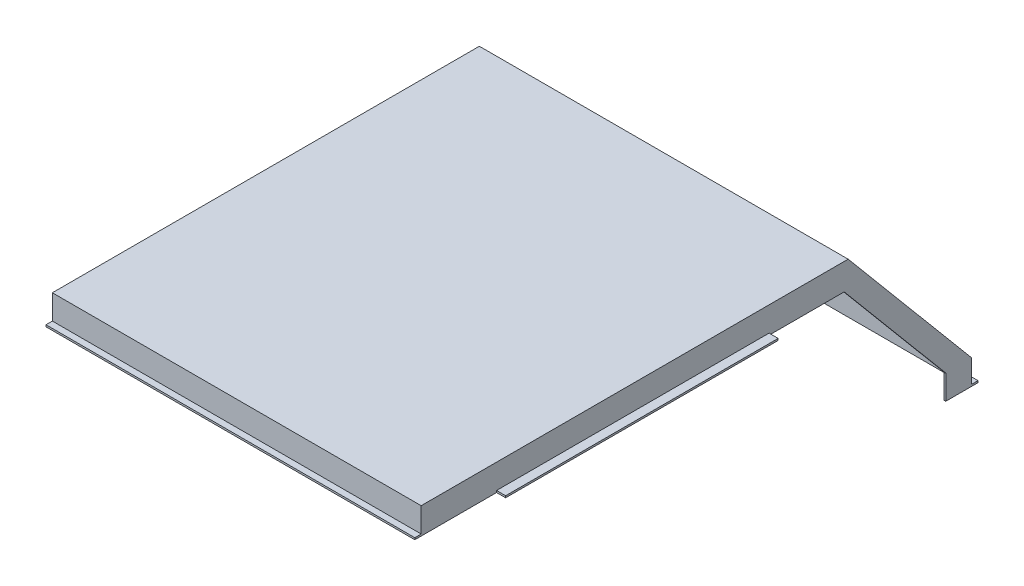
ISO-10303-21;
HEADER;
FILE_DESCRIPTION(('STEP AP214'),'2;1');
FILE_NAME('part.step','',(''),(''),'','','');
FILE_SCHEMA(('AUTOMOTIVE_DESIGN { 1 0 10303 214 1 1 1 1 }'));
ENDSEC;
DATA;
#1=APPLICATION_CONTEXT('core data for automotive mechanical design processes');
#2=APPLICATION_PROTOCOL_DEFINITION('international standard','automotive_design',2000,#1);
#3=PRODUCT_CONTEXT('',#1,'mechanical');
#4=PRODUCT('Part','Part','',(#3));
#5=PRODUCT_RELATED_PRODUCT_CATEGORY('part','',(#4));
#6=PRODUCT_DEFINITION_FORMATION('','',#4);
#7=PRODUCT_DEFINITION_CONTEXT('part definition',#1,'design');
#8=PRODUCT_DEFINITION('design','',#6,#7);
#9=PRODUCT_DEFINITION_SHAPE('','',#8);
#10=(LENGTH_UNIT() NAMED_UNIT(*) SI_UNIT(.MILLI.,.METRE.));
#11=(NAMED_UNIT(*) PLANE_ANGLE_UNIT() SI_UNIT($,.RADIAN.));
#12=(NAMED_UNIT(*) SI_UNIT($,.STERADIAN.) SOLID_ANGLE_UNIT());
#13=UNCERTAINTY_MEASURE_WITH_UNIT(LENGTH_MEASURE(1.E-05),#10,'distance_accuracy_value','');
#14=(GEOMETRIC_REPRESENTATION_CONTEXT(3) GLOBAL_UNCERTAINTY_ASSIGNED_CONTEXT((#13)) GLOBAL_UNIT_ASSIGNED_CONTEXT((#10,
#11,#12)) REPRESENTATION_CONTEXT('',''));
#15=CARTESIAN_POINT('',(0.,0.,0.));
#16=DIRECTION('',(0.,0.,1.));
#17=DIRECTION('',(1.,0.,0.));
#18=AXIS2_PLACEMENT_3D('',#15,#16,#17);
#19=CARTESIAN_POINT('',(203.,0.,-552.461255642924));
#20=DIRECTION('',(0.,0.,-1.));
#21=DIRECTION('',(-1.,0.,0.));
#22=AXIS2_PLACEMENT_3D('',#19,#20,#21);
#23=PLANE('',#22);
#24=DIRECTION('',(0.,1.,0.));
#25=VECTOR('',#24,1.);
#26=CARTESIAN_POINT('',(-151.,-185.74060970458,-552.461255642924));
#27=LINE('',#26,#25);
#28=CARTESIAN_POINT('',(-151.,-185.74060970458,-552.461255642924));
#29=VERTEX_POINT('',#28);
#30=CARTESIAN_POINT('',(-151.,-159.24060970458,-552.461255642924));
#31=VERTEX_POINT('',#30);
#32=EDGE_CURVE('E272',#29,#31,#27,.T.);
#33=ORIENTED_EDGE('',*,*,#32,.F.);
#34=DIRECTION('',(-1.,0.,0.));
#35=VECTOR('',#34,1.);
#36=CARTESIAN_POINT('',(203.,-185.74060970458,-552.461255642924));
#37=LINE('',#36,#35);
#38=CARTESIAN_POINT('',(201.,-185.74060970458,-552.461255642924));
#39=VERTEX_POINT('',#38);
#40=EDGE_CURVE('E500',#39,#29,#37,.T.);
#41=ORIENTED_EDGE('',*,*,#40,.F.);
#42=DIRECTION('',(0.,-1.,0.));
#43=VECTOR('',#42,1.);
#44=CARTESIAN_POINT('',(201.,-185.74060970458,-552.461255642924));
#45=LINE('',#44,#43);
#46=CARTESIAN_POINT('',(201.,-159.24060970458,-552.461255642924));
#47=VERTEX_POINT('',#46);
#48=EDGE_CURVE('E415',#47,#39,#45,.T.);
#49=ORIENTED_EDGE('',*,*,#48,.F.);
#50=DIRECTION('',(-1.,0.,0.));
#51=VECTOR('',#50,1.);
#52=CARTESIAN_POINT('',(203.,-159.24060970458,-552.461255642924));
#53=LINE('',#52,#51);
#54=EDGE_CURVE('E502',#47,#31,#53,.T.);
#55=ORIENTED_EDGE('',*,*,#54,.T.);
#56=EDGE_LOOP('',(#33,#41,#49,#55));
#57=FACE_BOUND('',#56,.T.);
#58=ADVANCED_FACE('F36',(#57),#23,.F.);
#59=CARTESIAN_POINT('',(203.,206.239679888601,-245.786879442717));
#60=DIRECTION('',(0.,0.642787609686544,-0.766044443118974));
#61=DIRECTION('',(0.,0.766044443118974,0.642787609686544));
#62=AXIS2_PLACEMENT_3D('',#59,#60,#61);
#63=PLANE('',#62);
#64=DIRECTION('',(0.,0.766044443118973,0.642787609686545));
#65=VECTOR('',#64,1.);
#66=CARTESIAN_POINT('',(-151.,-159.24060970458,-552.461255642924));
#67=LINE('',#66,#65);
#68=CARTESIAN_POINT('',(-151.,-76.669276521937,-483.175680423551));
#69=VERTEX_POINT('',#68);
#70=EDGE_CURVE('E286',#31,#69,#67,.T.);
#71=ORIENTED_EDGE('',*,*,#70,.F.);
#72=ORIENTED_EDGE('',*,*,#54,.F.);
#73=DIRECTION('',(0.,-0.766044443118974,-0.642787609686545));
#74=VECTOR('',#73,1.);
#75=CARTESIAN_POINT('',(201.,-159.24060970458,-552.461255642924));
#76=LINE('',#75,#74);
#77=CARTESIAN_POINT('',(201.,1.50000000000006,-417.583869324598));
#78=VERTEX_POINT('',#77);
#79=EDGE_CURVE('E437',#78,#47,#76,.T.);
#80=ORIENTED_EDGE('',*,*,#79,.F.);
#81=DIRECTION('',(-1.,0.,0.));
#82=VECTOR('',#81,1.);
#83=CARTESIAN_POINT('',(203.,1.5,-417.583869324598));
#84=LINE('',#83,#82);
#85=CARTESIAN_POINT('',(-201.,1.5,-417.583869324598));
#86=VERTEX_POINT('',#85);
#87=EDGE_CURVE('E505',#78,#86,#84,.T.);
#88=ORIENTED_EDGE('',*,*,#87,.T.);
#89=DIRECTION('',(0.,-0.766044443118974,-0.642787609686545));
#90=VECTOR('',#89,1.);
#91=CARTESIAN_POINT('',(-201.,-159.24060970458,-552.461255642924));
#92=LINE('',#91,#90);
#93=CARTESIAN_POINT('',(-201.,-76.669276521937,-483.175680423551));
#94=VERTEX_POINT('',#93);
#95=EDGE_CURVE('E349',#86,#94,#92,.T.);
#96=ORIENTED_EDGE('',*,*,#95,.T.);
#97=DIRECTION('',(-1.,0.,0.));
#98=VECTOR('',#97,1.);
#99=CARTESIAN_POINT('',(-153.,-76.669276521937,-483.175680423551));
#100=LINE('',#99,#98);
#101=EDGE_CURVE('E51',#69,#94,#100,.T.);
#102=ORIENTED_EDGE('',*,*,#101,.F.);
#103=EDGE_LOOP('',(#71,#72,#80,#88,#96,#102));
#104=FACE_BOUND('',#103,.T.);
#105=ADVANCED_FACE('F577',(#104),#63,.F.);
#106=CARTESIAN_POINT('',(-201.,-25.5,49.5387443544794));
#107=DIRECTION('',(1.,0.,0.));
#108=DIRECTION('',(0.,0.,-1.));
#109=AXIS2_PLACEMENT_3D('',#106,#107,#108);
#110=PLANE('',#109);
#111=DIRECTION('',(0.,-0.766044443118974,-0.642787609686545));
#112=VECTOR('',#111,1.);
#113=CARTESIAN_POINT('',(-201.,-172.096361898311,-537.140366780545));
#114=LINE('',#113,#112);
#115=CARTESIAN_POINT('',(-201.,-25.5,-414.131413579739));
#116=VERTEX_POINT('',#115);
#117=CARTESIAN_POINT('',(-201.,-107.783753059145,-483.175680423551));
#118=VERTEX_POINT('',#117);
#119=EDGE_CURVE('E352',#116,#118,#114,.T.);
#120=ORIENTED_EDGE('',*,*,#119,.T.);
#121=DIRECTION('',(0.,-1.,0.));
#122=VECTOR('',#121,1.);
#123=CARTESIAN_POINT('',(-201.,-107.783753059145,-483.175680423551));
#124=LINE('',#123,#122);
#125=EDGE_CURVE('E59',#94,#118,#124,.T.);
#126=ORIENTED_EDGE('',*,*,#125,.F.);
#127=ORIENTED_EDGE('',*,*,#95,.F.);
#128=DIRECTION('',(0.,0.,-1.));
#129=VECTOR('',#128,1.);
#130=CARTESIAN_POINT('',(-201.,1.5,49.5387443544794));
#131=LINE('',#130,#129);
#132=CARTESIAN_POINT('',(-201.,1.5,49.5387443544794));
#133=VERTEX_POINT('',#132);
#134=EDGE_CURVE('E358',#133,#86,#131,.T.);
#135=ORIENTED_EDGE('',*,*,#134,.F.);
#136=DIRECTION('',(0.,1.,0.));
#137=VECTOR('',#136,1.);
#138=CARTESIAN_POINT('',(-201.,-25.5,49.5387443544794));
#139=LINE('',#138,#137);
#140=CARTESIAN_POINT('',(-201.,-25.5,49.5387443544794));
#141=VERTEX_POINT('',#140);
#142=EDGE_CURVE('E362',#141,#133,#139,.T.);
#143=ORIENTED_EDGE('',*,*,#142,.F.);
#144=DIRECTION('',(0.,0.,-1.));
#145=VECTOR('',#144,1.);
#146=CARTESIAN_POINT('',(-201.,-25.5,49.5387443544794));
#147=LINE('',#146,#145);
#148=EDGE_CURVE('E359',#141,#116,#147,.T.);
#149=ORIENTED_EDGE('',*,*,#148,.T.);
#150=EDGE_LOOP('',(#120,#126,#127,#135,#143,#149));
#151=FACE_BOUND('',#150,.T.);
#152=ADVANCED_FACE('F583',(#151),#110,.T.);
#153=CARTESIAN_POINT('',(-203.,0.,0.));
#154=DIRECTION('',(-1.,0.,0.));
#155=DIRECTION('',(0.,0.,-1.));
#156=AXIS2_PLACEMENT_3D('',#153,#154,#155);
#157=PLANE('',#156);
#158=DIRECTION('',(0.,1.,0.));
#159=VECTOR('',#158,1.);
#160=CARTESIAN_POINT('',(-203.,-185.74160970458,-484.461255642924));
#161=LINE('',#160,#159);
#162=CARTESIAN_POINT('',(-203.,-109.315841945383,-484.461255642924));
#163=VERTEX_POINT('',#162);
#164=CARTESIAN_POINT('',(-203.,-75.0899177544543,-484.461255642924));
#165=VERTEX_POINT('',#164);
#166=EDGE_CURVE('E303',#163,#165,#161,.T.);
#167=ORIENTED_EDGE('',*,*,#166,.F.);
#168=DIRECTION('',(0.,0.766044443118974,0.642787609686545));
#169=VECTOR('',#168,1.);
#170=CARTESIAN_POINT('',(-203.,-172.096361898311,-537.140366780545));
#171=LINE('',#170,#169);
#172=CARTESIAN_POINT('',(-203.,-25.5,-414.131413579739));
#173=VERTEX_POINT('',#172);
#174=EDGE_CURVE('E350',#163,#173,#171,.T.);
#175=ORIENTED_EDGE('',*,*,#174,.T.);
#176=DIRECTION('',(0.,0.,1.));
#177=VECTOR('',#176,1.);
#178=CARTESIAN_POINT('',(-203.,-25.5,0.));
#179=LINE('',#178,#177);
#180=CARTESIAN_POINT('',(-203.,-25.5,-331.461255645521));
#181=VERTEX_POINT('',#180);
#182=EDGE_CURVE('E379',#173,#181,#179,.T.);
#183=ORIENTED_EDGE('',*,*,#182,.T.);
#184=DIRECTION('',(0.,1.,0.));
#185=VECTOR('',#184,1.);
#186=CARTESIAN_POINT('',(-203.,-25.5,-331.461255645521));
#187=LINE('',#186,#185);
#188=CARTESIAN_POINT('',(-203.,-23.5,-331.461255645521));
#189=VERTEX_POINT('',#188);
#190=EDGE_CURVE('E324',#181,#189,#187,.T.);
#191=ORIENTED_EDGE('',*,*,#190,.T.);
#192=DIRECTION('',(0.,0.,1.));
#193=VECTOR('',#192,1.);
#194=CARTESIAN_POINT('',(-203.,-23.5,-31.4612556455206));
#195=LINE('',#194,#193);
#196=CARTESIAN_POINT('',(-203.,-23.5,-31.4612556455206));
#197=VERTEX_POINT('',#196);
#198=EDGE_CURVE('E336',#189,#197,#195,.T.);
#199=ORIENTED_EDGE('',*,*,#198,.T.);
#200=DIRECTION('',(0.,-1.,0.));
#201=VECTOR('',#200,1.);
#202=CARTESIAN_POINT('',(-203.,-25.5,-31.4612556455206));
#203=LINE('',#202,#201);
#204=CARTESIAN_POINT('',(-203.,-25.5,-31.4612556455206));
#205=VERTEX_POINT('',#204);
#206=EDGE_CURVE('E263',#197,#205,#203,.T.);
#207=ORIENTED_EDGE('',*,*,#206,.T.);
#208=CARTESIAN_POINT('',(-203.,-25.5,58.5387443544794));
#209=VERTEX_POINT('',#208);
#210=EDGE_CURVE('E378',#205,#209,#179,.T.);
#211=ORIENTED_EDGE('',*,*,#210,.T.);
#212=DIRECTION('',(0.,-1.,0.));
#213=VECTOR('',#212,1.);
#214=CARTESIAN_POINT('',(-203.,0.,58.5387443544794));
#215=LINE('',#214,#213);
#216=CARTESIAN_POINT('',(-203.,-23.5,58.5387443544794));
#217=VERTEX_POINT('',#216);
#218=EDGE_CURVE('E382',#217,#209,#215,.T.);
#219=ORIENTED_EDGE('',*,*,#218,.F.);
#220=DIRECTION('',(0.,0.,1.));
#221=VECTOR('',#220,1.);
#222=CARTESIAN_POINT('',(-203.,-23.5,0.));
#223=LINE('',#222,#221);
#224=CARTESIAN_POINT('',(-203.,-23.5,51.5387443544794));
#225=VERTEX_POINT('',#224);
#226=EDGE_CURVE('E366',#225,#217,#223,.T.);
#227=ORIENTED_EDGE('',*,*,#226,.F.);
#228=DIRECTION('',(0.,-1.,0.));
#229=VECTOR('',#228,1.);
#230=CARTESIAN_POINT('',(-203.,0.,51.5387443544794));
#231=LINE('',#230,#229);
#232=CARTESIAN_POINT('',(-203.,3.5,51.5387443544794));
#233=VERTEX_POINT('',#232);
#234=EDGE_CURVE('E369',#233,#225,#231,.T.);
#235=ORIENTED_EDGE('',*,*,#234,.F.);
#236=DIRECTION('',(0.,0.,-1.));
#237=VECTOR('',#236,1.);
#238=CARTESIAN_POINT('',(-203.,3.5,0.));
#239=LINE('',#238,#237);
#240=CARTESIAN_POINT('',(-203.,3.5,-418.516484640908));
#241=VERTEX_POINT('',#240);
#242=EDGE_CURVE('E372',#233,#241,#239,.T.);
#243=ORIENTED_EDGE('',*,*,#242,.T.);
#244=DIRECTION('',(0.,-0.766044443118974,-0.642787609686544));
#245=VECTOR('',#244,1.);
#246=CARTESIAN_POINT('',(-203.,207.525255107974,-247.318968328954));
#247=LINE('',#246,#245);
#248=EDGE_CURVE('E375',#241,#165,#247,.T.);
#249=ORIENTED_EDGE('',*,*,#248,.T.);
#250=EDGE_LOOP('',(#167,#175,#183,#191,#199,#207,#211,#219,#227,#235,#243,#249));
#251=FACE_BOUND('',#250,.T.);
#252=ADVANCED_FACE('F527',(#251),#157,.T.);
#253=CARTESIAN_POINT('',(0.,193.38392769487,-230.465990580337));
#254=DIRECTION('',(0.,-0.642787609686545,0.766044443118974));
#255=DIRECTION('',(0.,-0.766044443118974,-0.642787609686545));
#256=AXIS2_PLACEMENT_3D('',#253,#254,#255);
#257=PLANE('',#256);
#258=DIRECTION('',(0.,-0.766044443118974,-0.642787609686545));
#259=VECTOR('',#258,1.);
#260=CARTESIAN_POINT('',(201.,-172.096361898311,-537.140366780545));
#261=LINE('',#260,#259);
#262=CARTESIAN_POINT('',(201.,-25.5,-414.131413579739));
#263=VERTEX_POINT('',#262);
#264=CARTESIAN_POINT('',(201.,-159.24060970458,-526.353109856279));
#265=VERTEX_POINT('',#264);
#266=EDGE_CURVE('E440',#263,#265,#261,.T.);
#267=ORIENTED_EDGE('',*,*,#266,.T.);
#268=DIRECTION('',(1.,0.,0.));
#269=VECTOR('',#268,1.);
#270=CARTESIAN_POINT('',(0.,-159.24060970458,-526.353109856279));
#271=LINE('',#270,#269);
#272=CARTESIAN_POINT('',(203.,-159.24060970458,-526.353109856279));
#273=VERTEX_POINT('',#272);
#274=EDGE_CURVE('E11',#265,#273,#271,.T.);
#275=ORIENTED_EDGE('',*,*,#274,.T.);
#276=DIRECTION('',(0.,0.766044443118974,0.642787609686545));
#277=VECTOR('',#276,1.);
#278=CARTESIAN_POINT('',(203.,-172.096361898311,-537.140366780545));
#279=LINE('',#278,#277);
#280=CARTESIAN_POINT('',(203.,-25.5,-414.131413579739));
#281=VERTEX_POINT('',#280);
#282=EDGE_CURVE('E438',#273,#281,#279,.T.);
#283=ORIENTED_EDGE('',*,*,#282,.T.);
#284=DIRECTION('',(-1.,0.,0.));
#285=VECTOR('',#284,1.);
#286=CARTESIAN_POINT('',(203.,-25.5,-414.131413579739));
#287=LINE('',#286,#285);
#288=EDGE_CURVE('E442',#281,#263,#287,.T.);
#289=ORIENTED_EDGE('',*,*,#288,.T.);
#290=EDGE_LOOP('',(#267,#275,#283,#289));
#291=FACE_BOUND('',#290,.T.);
#292=ADVANCED_FACE('F596',(#291),#257,.T.);
#293=CARTESIAN_POINT('',(203.,0.,49.5387443544794));
#294=DIRECTION('',(0.,0.,-1.));
#295=DIRECTION('',(-1.,0.,0.));
#296=AXIS2_PLACEMENT_3D('',#293,#294,#295);
#297=PLANE('',#296);
#298=ORIENTED_EDGE('',*,*,#142,.T.);
#299=DIRECTION('',(-1.,0.,0.));
#300=VECTOR('',#299,1.);
#301=CARTESIAN_POINT('',(203.,1.5,49.5387443544794));
#302=LINE('',#301,#300);
#303=CARTESIAN_POINT('',(201.,1.5,49.5387443544794));
#304=VERTEX_POINT('',#303);
#305=EDGE_CURVE('E508',#304,#133,#302,.T.);
#306=ORIENTED_EDGE('',*,*,#305,.F.);
#307=DIRECTION('',(0.,1.,0.));
#308=VECTOR('',#307,1.);
#309=CARTESIAN_POINT('',(201.,-25.5,49.5387443544794));
#310=LINE('',#309,#308);
#311=CARTESIAN_POINT('',(201.,-25.5,49.5387443544794));
#312=VERTEX_POINT('',#311);
#313=EDGE_CURVE('E450',#312,#304,#310,.T.);
#314=ORIENTED_EDGE('',*,*,#313,.F.);
#315=DIRECTION('',(-1.,0.,0.));
#316=VECTOR('',#315,1.);
#317=CARTESIAN_POINT('',(203.,-25.5,49.5387443544794));
#318=LINE('',#317,#316);
#319=EDGE_CURVE('E511',#312,#141,#318,.T.);
#320=ORIENTED_EDGE('',*,*,#319,.T.);
#321=EDGE_LOOP('',(#298,#306,#314,#320));
#322=FACE_BOUND('',#321,.T.);
#323=ADVANCED_FACE('F592',(#322),#297,.T.);
#324=CARTESIAN_POINT('',(203.,1.5,0.));
#325=DIRECTION('',(0.,1.,0.));
#326=DIRECTION('',(0.,0.,1.));
#327=AXIS2_PLACEMENT_3D('',#324,#325,#326);
#328=PLANE('',#327);
#329=ORIENTED_EDGE('',*,*,#305,.T.);
#330=ORIENTED_EDGE('',*,*,#134,.T.);
#331=ORIENTED_EDGE('',*,*,#87,.F.);
#332=DIRECTION('',(0.,0.,-1.));
#333=VECTOR('',#332,1.);
#334=CARTESIAN_POINT('',(201.,1.5,49.5387443544794));
#335=LINE('',#334,#333);
#336=EDGE_CURVE('E447',#304,#78,#335,.T.);
#337=ORIENTED_EDGE('',*,*,#336,.F.);
#338=EDGE_LOOP('',(#329,#330,#331,#337));
#339=FACE_BOUND('',#338,.T.);
#340=ADVANCED_FACE('F589',(#339),#328,.F.);
#341=CARTESIAN_POINT('',(203.,-23.5,0.));
#342=DIRECTION('',(0.,-1.,0.));
#343=DIRECTION('',(0.,0.,-1.));
#344=AXIS2_PLACEMENT_3D('',#341,#342,#343);
#345=PLANE('',#344);
#346=DIRECTION('',(-1.,0.,0.));
#347=VECTOR('',#346,1.);
#348=CARTESIAN_POINT('',(203.,-23.5,51.5387443544794));
#349=LINE('',#348,#347);
#350=CARTESIAN_POINT('',(203.,-23.5,51.5387443544794));
#351=VERTEX_POINT('',#350);
#352=EDGE_CURVE('E483',#351,#225,#349,.T.);
#353=ORIENTED_EDGE('',*,*,#352,.T.);
#354=ORIENTED_EDGE('',*,*,#226,.T.);
#355=DIRECTION('',(-1.,0.,0.));
#356=VECTOR('',#355,1.);
#357=CARTESIAN_POINT('',(203.,-23.5,58.5387443544794));
#358=LINE('',#357,#356);
#359=CARTESIAN_POINT('',(203.,-23.5,58.5387443544794));
#360=VERTEX_POINT('',#359);
#361=EDGE_CURVE('E44',#360,#217,#358,.T.);
#362=ORIENTED_EDGE('',*,*,#361,.F.);
#363=DIRECTION('',(0.,0.,1.));
#364=VECTOR('',#363,1.);
#365=CARTESIAN_POINT('',(203.,-23.5,0.));
#366=LINE('',#365,#364);
#367=EDGE_CURVE('E454',#351,#360,#366,.T.);
#368=ORIENTED_EDGE('',*,*,#367,.F.);
#369=EDGE_LOOP('',(#353,#354,#362,#368));
#370=FACE_BOUND('',#369,.T.);
#371=ADVANCED_FACE('F38',(#370),#345,.F.);
#372=CARTESIAN_POINT('',(203.,0.,58.5387443544794));
#373=DIRECTION('',(0.,0.,-1.));
#374=DIRECTION('',(-1.,0.,0.));
#375=AXIS2_PLACEMENT_3D('',#372,#373,#374);
#376=PLANE('',#375);
#377=ORIENTED_EDGE('',*,*,#361,.T.);
#378=ORIENTED_EDGE('',*,*,#218,.T.);
#379=DIRECTION('',(-1.,0.,0.));
#380=VECTOR('',#379,1.);
#381=CARTESIAN_POINT('',(203.,-25.5,58.5387443544794));
#382=LINE('',#381,#380);
#383=CARTESIAN_POINT('',(203.,-25.5,58.5387443544794));
#384=VERTEX_POINT('',#383);
#385=EDGE_CURVE('E513',#384,#209,#382,.T.);
#386=ORIENTED_EDGE('',*,*,#385,.F.);
#387=DIRECTION('',(0.,-1.,0.));
#388=VECTOR('',#387,1.);
#389=CARTESIAN_POINT('',(203.,0.,58.5387443544794));
#390=LINE('',#389,#388);
#391=EDGE_CURVE('E457',#360,#384,#390,.T.);
#392=ORIENTED_EDGE('',*,*,#391,.F.);
#393=EDGE_LOOP('',(#377,#378,#386,#392));
#394=FACE_BOUND('',#393,.T.);
#395=ADVANCED_FACE('F517',(#394),#376,.F.);
#396=CARTESIAN_POINT('',(203.,-25.5,0.));
#397=DIRECTION('',(0.,-1.,0.));
#398=DIRECTION('',(0.,0.,-1.));
#399=AXIS2_PLACEMENT_3D('',#396,#397,#398);
#400=PLANE('',#399);
#401=DIRECTION('',(-1.,0.,0.));
#402=VECTOR('',#401,1.);
#403=CARTESIAN_POINT('',(203.,-25.5,-414.131413579739));
#404=LINE('',#403,#402);
#405=EDGE_CURVE('E354',#116,#173,#404,.T.);
#406=ORIENTED_EDGE('',*,*,#405,.F.);
#407=ORIENTED_EDGE('',*,*,#148,.F.);
#408=ORIENTED_EDGE('',*,*,#319,.F.);
#409=DIRECTION('',(0.,0.,-1.));
#410=VECTOR('',#409,1.);
#411=CARTESIAN_POINT('',(201.,-25.5,49.5387443544794));
#412=LINE('',#411,#410);
#413=EDGE_CURVE('E448',#312,#263,#412,.T.);
#414=ORIENTED_EDGE('',*,*,#413,.T.);
#415=ORIENTED_EDGE('',*,*,#288,.F.);
#416=DIRECTION('',(0.,0.,1.));
#417=VECTOR('',#416,1.);
#418=CARTESIAN_POINT('',(203.,-25.5,0.));
#419=LINE('',#418,#417);
#420=CARTESIAN_POINT('',(203.,-25.5,-331.461255645521));
#421=VERTEX_POINT('',#420);
#422=EDGE_CURVE('E461',#281,#421,#419,.T.);
#423=ORIENTED_EDGE('',*,*,#422,.T.);
#424=DIRECTION('',(-1.,0.,0.));
#425=VECTOR('',#424,1.);
#426=CARTESIAN_POINT('',(213.,-25.5,-331.461255645521));
#427=LINE('',#426,#425);
#428=CARTESIAN_POINT('',(213.,-25.5,-331.461255645521));
#429=VERTEX_POINT('',#428);
#430=EDGE_CURVE('E409',#429,#421,#427,.T.);
#431=ORIENTED_EDGE('',*,*,#430,.F.);
#432=DIRECTION('',(0.,0.,-1.));
#433=VECTOR('',#432,1.);
#434=CARTESIAN_POINT('',(213.,-25.5,-31.4612556455206));
#435=LINE('',#434,#433);
#436=CARTESIAN_POINT('',(213.,-25.5,-31.4612556455206));
#437=VERTEX_POINT('',#436);
#438=EDGE_CURVE('E389',#437,#429,#435,.T.);
#439=ORIENTED_EDGE('',*,*,#438,.F.);
#440=DIRECTION('',(-1.,0.,0.));
#441=VECTOR('',#440,1.);
#442=CARTESIAN_POINT('',(213.,-25.5,-31.4612556455206));
#443=LINE('',#442,#441);
#444=CARTESIAN_POINT('',(203.,-25.5,-31.4612556455206));
#445=VERTEX_POINT('',#444);
#446=EDGE_CURVE('E412',#437,#445,#443,.T.);
#447=ORIENTED_EDGE('',*,*,#446,.T.);
#448=EDGE_CURVE('E460',#445,#384,#419,.T.);
#449=ORIENTED_EDGE('',*,*,#448,.T.);
#450=ORIENTED_EDGE('',*,*,#385,.T.);
#451=ORIENTED_EDGE('',*,*,#210,.F.);
#452=DIRECTION('',(1.,0.,0.));
#453=VECTOR('',#452,1.);
#454=CARTESIAN_POINT('',(-213.,-25.5,-31.4612556455206));
#455=LINE('',#454,#453);
#456=CARTESIAN_POINT('',(-213.,-25.5,-31.4612556455206));
#457=VERTEX_POINT('',#456);
#458=EDGE_CURVE('E333',#457,#205,#455,.T.);
#459=ORIENTED_EDGE('',*,*,#458,.F.);
#460=DIRECTION('',(0.,0.,-1.));
#461=VECTOR('',#460,1.);
#462=CARTESIAN_POINT('',(-213.,-25.5,-31.4612556455206));
#463=LINE('',#462,#461);
#464=CARTESIAN_POINT('',(-213.,-25.5,-331.461255645521));
#465=VERTEX_POINT('',#464);
#466=EDGE_CURVE('E330',#457,#465,#463,.T.);
#467=ORIENTED_EDGE('',*,*,#466,.T.);
#468=DIRECTION('',(1.,0.,0.));
#469=VECTOR('',#468,1.);
#470=CARTESIAN_POINT('',(-213.,-25.5,-331.461255645521));
#471=LINE('',#470,#469);
#472=EDGE_CURVE('E342',#465,#181,#471,.T.);
#473=ORIENTED_EDGE('',*,*,#472,.T.);
#474=ORIENTED_EDGE('',*,*,#182,.F.);
#475=EDGE_LOOP('',(#406,#407,#408,#414,#415,#423,#431,#439,#447,#449,#450,#451,#459,#467,#473,#474));
#476=FACE_BOUND('',#475,.T.);
#477=ADVANCED_FACE('F531',(#476),#400,.T.);
#478=CARTESIAN_POINT('',(203.,-185.74060970458,0.));
#479=DIRECTION('',(0.,1.,0.));
#480=DIRECTION('',(0.,0.,1.));
#481=AXIS2_PLACEMENT_3D('',#478,#479,#480);
#482=PLANE('',#481);
#483=ORIENTED_EDGE('',*,*,#40,.T.);
#484=DIRECTION('',(0.,0.,-1.));
#485=VECTOR('',#484,1.);
#486=CARTESIAN_POINT('',(-151.,-185.74060970458,-537.140366780545));
#487=LINE('',#486,#485);
#488=CARTESIAN_POINT('',(-151.,-185.74060970458,-537.140366780545));
#489=VERTEX_POINT('',#488);
#490=EDGE_CURVE('E276',#489,#29,#487,.T.);
#491=ORIENTED_EDGE('',*,*,#490,.F.);
#492=DIRECTION('',(1.,0.,0.));
#493=VECTOR('',#492,1.);
#494=CARTESIAN_POINT('',(-153.,-185.74060970458,-537.140366780545));
#495=LINE('',#494,#493);
#496=CARTESIAN_POINT('',(-153.,-185.74060970458,-537.140366780545));
#497=VERTEX_POINT('',#496);
#498=EDGE_CURVE('E268',#497,#489,#495,.T.);
#499=ORIENTED_EDGE('',*,*,#498,.F.);
#500=DIRECTION('',(0.,0.,1.));
#501=VECTOR('',#500,1.);
#502=CARTESIAN_POINT('',(-153.,-185.74060970458,-561.461255642924));
#503=LINE('',#502,#501);
#504=CARTESIAN_POINT('',(-153.,-185.74060970458,-561.461255642924));
#505=VERTEX_POINT('',#504);
#506=EDGE_CURVE('E251',#505,#497,#503,.T.);
#507=ORIENTED_EDGE('',*,*,#506,.F.);
#508=DIRECTION('',(-1.,0.,0.));
#509=VECTOR('',#508,1.);
#510=CARTESIAN_POINT('',(203.,-185.74060970458,-561.461255642924));
#511=LINE('',#510,#509);
#512=CARTESIAN_POINT('',(203.,-185.74060970458,-561.461255642924));
#513=VERTEX_POINT('',#512);
#514=EDGE_CURVE('E498',#513,#505,#511,.T.);
#515=ORIENTED_EDGE('',*,*,#514,.F.);
#516=DIRECTION('',(0.,0.,-1.));
#517=VECTOR('',#516,1.);
#518=CARTESIAN_POINT('',(203.,-185.74060970458,0.));
#519=LINE('',#518,#517);
#520=CARTESIAN_POINT('',(203.,-185.74060970458,-525.961255642924));
#521=VERTEX_POINT('',#520);
#522=EDGE_CURVE('E464',#521,#513,#519,.T.);
#523=ORIENTED_EDGE('',*,*,#522,.F.);
#524=DIRECTION('',(1.,0.,0.));
#525=VECTOR('',#524,1.);
#526=CARTESIAN_POINT('',(203.,-185.74060970458,-525.961255642924));
#527=LINE('',#526,#525);
#528=CARTESIAN_POINT('',(201.,-185.74060970458,-525.961255642924));
#529=VERTEX_POINT('',#528);
#530=EDGE_CURVE('E423',#529,#521,#527,.T.);
#531=ORIENTED_EDGE('',*,*,#530,.F.);
#532=DIRECTION('',(0.,0.,-1.));
#533=VECTOR('',#532,1.);
#534=CARTESIAN_POINT('',(201.,-185.74060970458,-525.961255642924));
#535=LINE('',#534,#533);
#536=EDGE_CURVE('E426',#529,#39,#535,.T.);
#537=ORIENTED_EDGE('',*,*,#536,.T.);
#538=EDGE_LOOP('',(#483,#491,#499,#507,#515,#523,#531,#537));
#539=FACE_BOUND('',#538,.T.);
#540=ADVANCED_FACE('F275',(#539),#482,.F.);
#541=CARTESIAN_POINT('',(203.,0.,-561.461255642924));
#542=DIRECTION('',(0.,0.,-1.));
#543=DIRECTION('',(-1.,0.,0.));
#544=AXIS2_PLACEMENT_3D('',#541,#542,#543);
#545=PLANE('',#544);
#546=DIRECTION('',(0.,1.,0.));
#547=VECTOR('',#546,1.);
#548=CARTESIAN_POINT('',(-153.,-185.74160970458,-561.461255642924));
#549=LINE('',#548,#547);
#550=CARTESIAN_POINT('',(-153.,-183.74060970458,-561.461255642924));
#551=VERTEX_POINT('',#550);
#552=EDGE_CURVE('E258',#505,#551,#549,.T.);
#553=ORIENTED_EDGE('',*,*,#552,.T.);
#554=DIRECTION('',(-1.,0.,0.));
#555=VECTOR('',#554,1.);
#556=CARTESIAN_POINT('',(203.,-183.74060970458,-561.461255642924));
#557=LINE('',#556,#555);
#558=CARTESIAN_POINT('',(203.,-183.74060970458,-561.461255642924));
#559=VERTEX_POINT('',#558);
#560=EDGE_CURVE('E495',#559,#551,#557,.T.);
#561=ORIENTED_EDGE('',*,*,#560,.F.);
#562=DIRECTION('',(0.,-1.,0.));
#563=VECTOR('',#562,1.);
#564=CARTESIAN_POINT('',(203.,0.,-561.461255642924));
#565=LINE('',#564,#563);
#566=EDGE_CURVE('E466',#559,#513,#565,.T.);
#567=ORIENTED_EDGE('',*,*,#566,.T.);
#568=ORIENTED_EDGE('',*,*,#514,.T.);
#569=EDGE_LOOP('',(#553,#561,#567,#568));
#570=FACE_BOUND('',#569,.T.);
#571=ADVANCED_FACE('F655',(#570),#545,.T.);
#572=CARTESIAN_POINT('',(203.,-183.74060970458,0.));
#573=DIRECTION('',(0.,1.,0.));
#574=DIRECTION('',(0.,0.,1.));
#575=AXIS2_PLACEMENT_3D('',#572,#573,#574);
#576=PLANE('',#575);
#577=DIRECTION('',(0.,0.,1.));
#578=VECTOR('',#577,1.);
#579=CARTESIAN_POINT('',(-153.,-183.74060970458,-561.461255642924));
#580=LINE('',#579,#578);
#581=CARTESIAN_POINT('',(-153.,-183.74060970458,-554.461255642924));
#582=VERTEX_POINT('',#581);
#583=EDGE_CURVE('E264',#551,#582,#580,.T.);
#584=ORIENTED_EDGE('',*,*,#583,.T.);
#585=DIRECTION('',(-1.,0.,0.));
#586=VECTOR('',#585,1.);
#587=CARTESIAN_POINT('',(203.,-183.74060970458,-554.461255642924));
#588=LINE('',#587,#586);
#589=CARTESIAN_POINT('',(203.,-183.74060970458,-554.461255642924));
#590=VERTEX_POINT('',#589);
#591=EDGE_CURVE('E492',#590,#582,#588,.T.);
#592=ORIENTED_EDGE('',*,*,#591,.F.);
#593=DIRECTION('',(0.,0.,-1.));
#594=VECTOR('',#593,1.);
#595=CARTESIAN_POINT('',(203.,-183.74060970458,0.));
#596=LINE('',#595,#594);
#597=EDGE_CURVE('E469',#590,#559,#596,.T.);
#598=ORIENTED_EDGE('',*,*,#597,.T.);
#599=ORIENTED_EDGE('',*,*,#560,.T.);
#600=EDGE_LOOP('',(#584,#592,#598,#599));
#601=FACE_BOUND('',#600,.T.);
#602=ADVANCED_FACE('F837',(#601),#576,.T.);
#603=CARTESIAN_POINT('',(203.,0.,-554.461255642924));
#604=DIRECTION('',(0.,0.,-1.));
#605=DIRECTION('',(-1.,0.,0.));
#606=AXIS2_PLACEMENT_3D('',#603,#604,#605);
#607=PLANE('',#606);
#608=DIRECTION('',(0.,1.,0.));
#609=VECTOR('',#608,1.);
#610=CARTESIAN_POINT('',(-153.,-185.74160970458,-554.461255642924));
#611=LINE('',#610,#609);
#612=CARTESIAN_POINT('',(-153.,-158.512669236048,-554.461255642924));
#613=VERTEX_POINT('',#612);
#614=EDGE_CURVE('E315',#582,#613,#611,.T.);
#615=ORIENTED_EDGE('',*,*,#614,.T.);
#616=DIRECTION('',(-1.,0.,0.));
#617=VECTOR('',#616,1.);
#618=CARTESIAN_POINT('',(203.,-158.512669236048,-554.461255642924));
#619=LINE('',#618,#617);
#620=CARTESIAN_POINT('',(203.,-158.512669236048,-554.461255642924));
#621=VERTEX_POINT('',#620);
#622=EDGE_CURVE('E489',#621,#613,#619,.T.);
#623=ORIENTED_EDGE('',*,*,#622,.F.);
#624=DIRECTION('',(0.,-1.,0.));
#625=VECTOR('',#624,1.);
#626=CARTESIAN_POINT('',(203.,0.,-554.461255642924));
#627=LINE('',#626,#625);
#628=EDGE_CURVE('E472',#621,#590,#627,.T.);
#629=ORIENTED_EDGE('',*,*,#628,.T.);
#630=ORIENTED_EDGE('',*,*,#591,.T.);
#631=EDGE_LOOP('',(#615,#623,#629,#630));
#632=FACE_BOUND('',#631,.T.);
#633=ADVANCED_FACE('F834',(#632),#607,.T.);
#634=CARTESIAN_POINT('',(203.,207.525255107974,-247.318968328954));
#635=DIRECTION('',(0.,0.642787609686544,-0.766044443118974));
#636=DIRECTION('',(0.,0.766044443118974,0.642787609686544));
#637=AXIS2_PLACEMENT_3D('',#634,#635,#636);
#638=PLANE('',#637);
#639=DIRECTION('',(0.,0.766044443118974,0.642787609686544));
#640=VECTOR('',#639,1.);
#641=CARTESIAN_POINT('',(-153.,-177.938094551938,-570.76112286095));
#642=LINE('',#641,#640);
#643=CARTESIAN_POINT('',(-153.,-75.0899177544543,-484.461255642924));
#644=VERTEX_POINT('',#643);
#645=EDGE_CURVE('E300',#613,#644,#642,.T.);
#646=ORIENTED_EDGE('',*,*,#645,.T.);
#647=DIRECTION('',(-1.,0.,0.));
#648=VECTOR('',#647,1.);
#649=CARTESIAN_POINT('',(-203.,-75.0899177544543,-484.461255642924));
#650=LINE('',#649,#648);
#651=EDGE_CURVE('E312',#644,#165,#650,.T.);
#652=ORIENTED_EDGE('',*,*,#651,.T.);
#653=ORIENTED_EDGE('',*,*,#248,.F.);
#654=DIRECTION('',(-1.,0.,0.));
#655=VECTOR('',#654,1.);
#656=CARTESIAN_POINT('',(203.,3.5,-418.516484640908));
#657=LINE('',#656,#655);
#658=CARTESIAN_POINT('',(203.,3.5,-418.516484640908));
#659=VERTEX_POINT('',#658);
#660=EDGE_CURVE('E487',#659,#241,#657,.T.);
#661=ORIENTED_EDGE('',*,*,#660,.F.);
#662=DIRECTION('',(0.,-0.766044443118974,-0.642787609686544));
#663=VECTOR('',#662,1.);
#664=CARTESIAN_POINT('',(203.,207.525255107974,-247.318968328954));
#665=LINE('',#664,#663);
#666=EDGE_CURVE('E475',#659,#621,#665,.T.);
#667=ORIENTED_EDGE('',*,*,#666,.T.);
#668=ORIENTED_EDGE('',*,*,#622,.T.);
#669=EDGE_LOOP('',(#646,#652,#653,#661,#667,#668));
#670=FACE_BOUND('',#669,.T.);
#671=ADVANCED_FACE('F544',(#670),#638,.T.);
#672=CARTESIAN_POINT('',(203.,3.5,0.));
#673=DIRECTION('',(0.,1.,0.));
#674=DIRECTION('',(0.,0.,1.));
#675=AXIS2_PLACEMENT_3D('',#672,#673,#674);
#676=PLANE('',#675);
#677=ORIENTED_EDGE('',*,*,#660,.T.);
#678=ORIENTED_EDGE('',*,*,#242,.F.);
#679=DIRECTION('',(-1.,0.,0.));
#680=VECTOR('',#679,1.);
#681=CARTESIAN_POINT('',(203.,3.5,51.5387443544794));
#682=LINE('',#681,#680);
#683=CARTESIAN_POINT('',(203.,3.5,51.5387443544794));
#684=VERTEX_POINT('',#683);
#685=EDGE_CURVE('E485',#684,#233,#682,.T.);
#686=ORIENTED_EDGE('',*,*,#685,.F.);
#687=DIRECTION('',(0.,0.,-1.));
#688=VECTOR('',#687,1.);
#689=CARTESIAN_POINT('',(203.,3.5,0.));
#690=LINE('',#689,#688);
#691=EDGE_CURVE('E478',#684,#659,#690,.T.);
#692=ORIENTED_EDGE('',*,*,#691,.T.);
#693=EDGE_LOOP('',(#677,#678,#686,#692));
#694=FACE_BOUND('',#693,.T.);
#695=ADVANCED_FACE('F829',(#694),#676,.T.);
#696=CARTESIAN_POINT('',(203.,0.,51.5387443544794));
#697=DIRECTION('',(0.,0.,-1.));
#698=DIRECTION('',(-1.,0.,0.));
#699=AXIS2_PLACEMENT_3D('',#696,#697,#698);
#700=PLANE('',#699);
#701=ORIENTED_EDGE('',*,*,#685,.T.);
#702=ORIENTED_EDGE('',*,*,#234,.T.);
#703=ORIENTED_EDGE('',*,*,#352,.F.);
#704=DIRECTION('',(0.,-1.,0.));
#705=VECTOR('',#704,1.);
#706=CARTESIAN_POINT('',(203.,0.,51.5387443544794));
#707=LINE('',#706,#705);
#708=EDGE_CURVE('E481',#684,#351,#707,.T.);
#709=ORIENTED_EDGE('',*,*,#708,.F.);
#710=EDGE_LOOP('',(#701,#702,#703,#709));
#711=FACE_BOUND('',#710,.T.);
#712=ADVANCED_FACE('F539',(#711),#700,.F.);
#713=CARTESIAN_POINT('',(203.,0.,0.));
#714=DIRECTION('',(1.,0.,0.));
#715=DIRECTION('',(0.,0.,-1.));
#716=AXIS2_PLACEMENT_3D('',#713,#714,#715);
#717=PLANE('',#716);
#718=DIRECTION('',(0.,-1.,0.));
#719=VECTOR('',#718,1.);
#720=CARTESIAN_POINT('',(203.,-25.5,-31.4612556455206));
#721=LINE('',#720,#719);
#722=CARTESIAN_POINT('',(203.,-23.5,-31.4612556455206));
#723=VERTEX_POINT('',#722);
#724=EDGE_CURVE('E385',#723,#445,#721,.T.);
#725=ORIENTED_EDGE('',*,*,#724,.F.);
#726=DIRECTION('',(0.,0.,1.));
#727=VECTOR('',#726,1.);
#728=CARTESIAN_POINT('',(203.,-23.5,-31.4612556455206));
#729=LINE('',#728,#727);
#730=CARTESIAN_POINT('',(203.,-23.5,-331.461255645521));
#731=VERTEX_POINT('',#730);
#732=EDGE_CURVE('E390',#731,#723,#729,.T.);
#733=ORIENTED_EDGE('',*,*,#732,.F.);
#734=DIRECTION('',(0.,1.,0.));
#735=VECTOR('',#734,1.);
#736=CARTESIAN_POINT('',(203.,-25.5,-331.461255645521));
#737=LINE('',#736,#735);
#738=EDGE_CURVE('E399',#421,#731,#737,.T.);
#739=ORIENTED_EDGE('',*,*,#738,.F.);
#740=ORIENTED_EDGE('',*,*,#422,.F.);
#741=ORIENTED_EDGE('',*,*,#282,.F.);
#742=DIRECTION('',(0.,0.,-1.));
#743=VECTOR('',#742,1.);
#744=CARTESIAN_POINT('',(203.,-159.24060970458,-525.961255642924));
#745=LINE('',#744,#743);
#746=CARTESIAN_POINT('',(203.,-159.24060970458,-525.961255642924));
#747=VERTEX_POINT('',#746);
#748=EDGE_CURVE('E434',#747,#273,#745,.T.);
#749=ORIENTED_EDGE('',*,*,#748,.F.);
#750=DIRECTION('',(0.,1.,0.));
#751=VECTOR('',#750,1.);
#752=CARTESIAN_POINT('',(203.,-185.74060970458,-525.961255642924));
#753=LINE('',#752,#751);
#754=EDGE_CURVE('E416',#521,#747,#753,.T.);
#755=ORIENTED_EDGE('',*,*,#754,.F.);
#756=ORIENTED_EDGE('',*,*,#522,.T.);
#757=ORIENTED_EDGE('',*,*,#566,.F.);
#758=ORIENTED_EDGE('',*,*,#597,.F.);
#759=ORIENTED_EDGE('',*,*,#628,.F.);
#760=ORIENTED_EDGE('',*,*,#666,.F.);
#761=ORIENTED_EDGE('',*,*,#691,.F.);
#762=ORIENTED_EDGE('',*,*,#708,.T.);
#763=ORIENTED_EDGE('',*,*,#367,.T.);
#764=ORIENTED_EDGE('',*,*,#391,.T.);
#765=ORIENTED_EDGE('',*,*,#448,.F.);
#766=EDGE_LOOP('',(#725,#733,#739,#740,#741,#749,#755,#756,#757,#758,#759,#760,#761,#762,#763,
#764,#765));
#767=FACE_BOUND('',#766,.T.);
#768=ADVANCED_FACE('F534',(#767),#717,.T.);
#769=CARTESIAN_POINT('',(201.,-25.5,49.5387443544794));
#770=DIRECTION('',(1.,0.,0.));
#771=DIRECTION('',(0.,0.,-1.));
#772=AXIS2_PLACEMENT_3D('',#769,#770,#771);
#773=PLANE('',#772);
#774=DIRECTION('',(0.,0.,-1.));
#775=VECTOR('',#774,1.);
#776=CARTESIAN_POINT('',(201.,-159.24060970458,-525.961255642924));
#777=LINE('',#776,#775);
#778=CARTESIAN_POINT('',(201.,-159.24060970458,-525.961255642924));
#779=VERTEX_POINT('',#778);
#780=EDGE_CURVE('E431',#779,#265,#777,.T.);
#781=ORIENTED_EDGE('',*,*,#780,.T.);
#782=ORIENTED_EDGE('',*,*,#266,.F.);
#783=ORIENTED_EDGE('',*,*,#413,.F.);
#784=ORIENTED_EDGE('',*,*,#313,.T.);
#785=ORIENTED_EDGE('',*,*,#336,.T.);
#786=ORIENTED_EDGE('',*,*,#79,.T.);
#787=ORIENTED_EDGE('',*,*,#48,.T.);
#788=ORIENTED_EDGE('',*,*,#536,.F.);
#789=DIRECTION('',(0.,-1.,0.));
#790=VECTOR('',#789,1.);
#791=CARTESIAN_POINT('',(201.,-185.74060970458,-525.961255642924));
#792=LINE('',#791,#790);
#793=EDGE_CURVE('E421',#779,#529,#792,.T.);
#794=ORIENTED_EDGE('',*,*,#793,.F.);
#795=EDGE_LOOP('',(#781,#782,#783,#784,#785,#786,#787,#788,#794));
#796=FACE_BOUND('',#795,.T.);
#797=ADVANCED_FACE('F819',(#796),#773,.F.);
#798=CARTESIAN_POINT('',(203.,-159.24060970458,-525.961255642924));
#799=DIRECTION('',(0.,-1.,0.));
#800=DIRECTION('',(0.,0.,-1.));
#801=AXIS2_PLACEMENT_3D('',#798,#799,#800);
#802=PLANE('',#801);
#803=ORIENTED_EDGE('',*,*,#274,.F.);
#804=ORIENTED_EDGE('',*,*,#780,.F.);
#805=DIRECTION('',(-1.,0.,0.));
#806=VECTOR('',#805,1.);
#807=CARTESIAN_POINT('',(203.,-159.24060970458,-525.961255642924));
#808=LINE('',#807,#806);
#809=EDGE_CURVE('E419',#747,#779,#808,.T.);
#810=ORIENTED_EDGE('',*,*,#809,.F.);
#811=ORIENTED_EDGE('',*,*,#748,.T.);
#812=EDGE_LOOP('',(#803,#804,#810,#811));
#813=FACE_BOUND('',#812,.T.);
#814=ADVANCED_FACE('F816',(#813),#802,.F.);
#815=CARTESIAN_POINT('',(0.,0.,-525.961255642924));
#816=DIRECTION('',(0.,0.,1.));
#817=DIRECTION('',(1.,0.,0.));
#818=AXIS2_PLACEMENT_3D('',#815,#816,#817);
#819=PLANE('',#818);
#820=ORIENTED_EDGE('',*,*,#754,.T.);
#821=ORIENTED_EDGE('',*,*,#809,.T.);
#822=ORIENTED_EDGE('',*,*,#793,.T.);
#823=ORIENTED_EDGE('',*,*,#530,.T.);
#824=EDGE_LOOP('',(#820,#821,#822,#823));
#825=FACE_BOUND('',#824,.T.);
#826=ADVANCED_FACE('F812',(#825),#819,.T.);
#827=CARTESIAN_POINT('',(213.,-25.5,-31.4612556455206));
#828=DIRECTION('',(0.,0.,-1.));
#829=DIRECTION('',(-1.,0.,0.));
#830=AXIS2_PLACEMENT_3D('',#827,#828,#829);
#831=PLANE('',#830);
#832=ORIENTED_EDGE('',*,*,#724,.T.);
#833=ORIENTED_EDGE('',*,*,#446,.F.);
#834=DIRECTION('',(0.,-1.,0.));
#835=VECTOR('',#834,1.);
#836=CARTESIAN_POINT('',(213.,-25.5,-31.4612556455206));
#837=LINE('',#836,#835);
#838=CARTESIAN_POINT('',(213.,-23.5,-31.4612556455206));
#839=VERTEX_POINT('',#838);
#840=EDGE_CURVE('E386',#839,#437,#837,.T.);
#841=ORIENTED_EDGE('',*,*,#840,.F.);
#842=DIRECTION('',(-1.,0.,0.));
#843=VECTOR('',#842,1.);
#844=CARTESIAN_POINT('',(213.,-23.5,-31.4612556455206));
#845=LINE('',#844,#843);
#846=EDGE_CURVE('E396',#839,#723,#845,.T.);
#847=ORIENTED_EDGE('',*,*,#846,.T.);
#848=EDGE_LOOP('',(#832,#833,#841,#847));
#849=FACE_BOUND('',#848,.T.);
#850=ADVANCED_FACE('F808',(#849),#831,.F.);
#851=CARTESIAN_POINT('',(213.,-25.5,-331.461255645521));
#852=DIRECTION('',(0.,0.,1.));
#853=DIRECTION('',(1.,0.,0.));
#854=AXIS2_PLACEMENT_3D('',#851,#852,#853);
#855=PLANE('',#854);
#856=ORIENTED_EDGE('',*,*,#738,.T.);
#857=DIRECTION('',(-1.,0.,0.));
#858=VECTOR('',#857,1.);
#859=CARTESIAN_POINT('',(213.,-23.5,-331.461255645521));
#860=LINE('',#859,#858);
#861=CARTESIAN_POINT('',(213.,-23.5,-331.461255645521));
#862=VERTEX_POINT('',#861);
#863=EDGE_CURVE('E406',#862,#731,#860,.T.);
#864=ORIENTED_EDGE('',*,*,#863,.F.);
#865=DIRECTION('',(0.,1.,0.));
#866=VECTOR('',#865,1.);
#867=CARTESIAN_POINT('',(213.,-25.5,-331.461255645521));
#868=LINE('',#867,#866);
#869=EDGE_CURVE('E392',#429,#862,#868,.T.);
#870=ORIENTED_EDGE('',*,*,#869,.F.);
#871=ORIENTED_EDGE('',*,*,#430,.T.);
#872=EDGE_LOOP('',(#856,#864,#870,#871));
#873=FACE_BOUND('',#872,.T.);
#874=ADVANCED_FACE('F804',(#873),#855,.F.);
#875=CARTESIAN_POINT('',(213.,-23.5,-31.4612556455206));
#876=DIRECTION('',(0.,-1.,0.));
#877=DIRECTION('',(0.,0.,-1.));
#878=AXIS2_PLACEMENT_3D('',#875,#876,#877);
#879=PLANE('',#878);
#880=ORIENTED_EDGE('',*,*,#732,.T.);
#881=ORIENTED_EDGE('',*,*,#846,.F.);
#882=DIRECTION('',(0.,0.,1.));
#883=VECTOR('',#882,1.);
#884=CARTESIAN_POINT('',(213.,-23.5,-31.4612556455206));
#885=LINE('',#884,#883);
#886=EDGE_CURVE('E394',#862,#839,#885,.T.);
#887=ORIENTED_EDGE('',*,*,#886,.F.);
#888=ORIENTED_EDGE('',*,*,#863,.T.);
#889=EDGE_LOOP('',(#880,#881,#887,#888));
#890=FACE_BOUND('',#889,.T.);
#891=ADVANCED_FACE('F800',(#890),#879,.F.);
#892=CARTESIAN_POINT('',(213.,0.,0.));
#893=DIRECTION('',(-1.,0.,0.));
#894=DIRECTION('',(0.,0.,1.));
#895=AXIS2_PLACEMENT_3D('',#892,#893,#894);
#896=PLANE('',#895);
#897=ORIENTED_EDGE('',*,*,#840,.T.);
#898=ORIENTED_EDGE('',*,*,#438,.T.);
#899=ORIENTED_EDGE('',*,*,#869,.T.);
#900=ORIENTED_EDGE('',*,*,#886,.T.);
#901=EDGE_LOOP('',(#897,#898,#899,#900));
#902=FACE_BOUND('',#901,.T.);
#903=ADVANCED_FACE('F665',(#902),#896,.F.);
#904=CARTESIAN_POINT('',(0.,193.38392769487,-230.465990580337));
#905=DIRECTION('',(0.,-0.642787609686545,0.766044443118974));
#906=DIRECTION('',(0.,-0.766044443118974,-0.642787609686545));
#907=AXIS2_PLACEMENT_3D('',#904,#905,#906);
#908=PLANE('',#907);
#909=DIRECTION('',(0.,0.766044443118973,0.642787609686545));
#910=VECTOR('',#909,1.);
#911=CARTESIAN_POINT('',(-151.,-172.096361898311,-537.140366780545));
#912=LINE('',#911,#910);
#913=CARTESIAN_POINT('',(-151.,-172.096361898311,-537.140366780545));
#914=VERTEX_POINT('',#913);
#915=CARTESIAN_POINT('',(-151.,-107.783753059145,-483.175680423551));
#916=VERTEX_POINT('',#915);
#917=EDGE_CURVE('E287',#914,#916,#912,.T.);
#918=ORIENTED_EDGE('',*,*,#917,.T.);
#919=DIRECTION('',(-1.,0.,0.));
#920=VECTOR('',#919,1.);
#921=CARTESIAN_POINT('',(-153.,-107.783753059145,-483.175680423551));
#922=LINE('',#921,#920);
#923=EDGE_CURVE('E296',#916,#118,#922,.T.);
#924=ORIENTED_EDGE('',*,*,#923,.T.);
#925=ORIENTED_EDGE('',*,*,#119,.F.);
#926=ORIENTED_EDGE('',*,*,#405,.T.);
#927=ORIENTED_EDGE('',*,*,#174,.F.);
#928=DIRECTION('',(1.,0.,0.));
#929=VECTOR('',#928,1.);
#930=CARTESIAN_POINT('',(-203.,-109.315841945383,-484.461255642924));
#931=LINE('',#930,#929);
#932=CARTESIAN_POINT('',(-153.,-109.315841945383,-484.461255642924));
#933=VERTEX_POINT('',#932);
#934=EDGE_CURVE('E305',#163,#933,#931,.T.);
#935=ORIENTED_EDGE('',*,*,#934,.T.);
#936=DIRECTION('',(0.,-0.766044443118973,-0.642787609686545));
#937=VECTOR('',#936,1.);
#938=CARTESIAN_POINT('',(-153.,-172.096361898311,-537.140366780545));
#939=LINE('',#938,#937);
#940=CARTESIAN_POINT('',(-153.,-172.096361898311,-537.140366780545));
#941=VERTEX_POINT('',#940);
#942=EDGE_CURVE('E290',#933,#941,#939,.T.);
#943=ORIENTED_EDGE('',*,*,#942,.T.);
#944=DIRECTION('',(1.,0.,0.));
#945=VECTOR('',#944,1.);
#946=CARTESIAN_POINT('',(-151.,-172.096361898311,-537.140366780545));
#947=LINE('',#946,#945);
#948=EDGE_CURVE('E271',#941,#914,#947,.T.);
#949=ORIENTED_EDGE('',*,*,#948,.T.);
#950=EDGE_LOOP('',(#918,#924,#925,#926,#927,#935,#943,#949));
#951=FACE_BOUND('',#950,.T.);
#952=ADVANCED_FACE('F548',(#951),#908,.T.);
#953=CARTESIAN_POINT('',(-213.,-25.5,-31.4612556455206));
#954=DIRECTION('',(0.,0.,1.));
#955=DIRECTION('',(1.,0.,0.));
#956=AXIS2_PLACEMENT_3D('',#953,#954,#955);
#957=PLANE('',#956);
#958=ORIENTED_EDGE('',*,*,#206,.F.);
#959=DIRECTION('',(1.,0.,0.));
#960=VECTOR('',#959,1.);
#961=CARTESIAN_POINT('',(-213.,-23.5,-31.4612556455206));
#962=LINE('',#961,#960);
#963=CARTESIAN_POINT('',(-213.,-23.5,-31.4612556455206));
#964=VERTEX_POINT('',#963);
#965=EDGE_CURVE('E346',#964,#197,#962,.T.);
#966=ORIENTED_EDGE('',*,*,#965,.F.);
#967=DIRECTION('',(0.,-1.,0.));
#968=VECTOR('',#967,1.);
#969=CARTESIAN_POINT('',(-213.,-25.5,-31.4612556455206));
#970=LINE('',#969,#968);
#971=EDGE_CURVE('E320',#964,#457,#970,.T.);
#972=ORIENTED_EDGE('',*,*,#971,.T.);
#973=ORIENTED_EDGE('',*,*,#458,.T.);
#974=EDGE_LOOP('',(#958,#966,#972,#973));
#975=FACE_BOUND('',#974,.T.);
#976=ADVANCED_FACE('F564',(#975),#957,.T.);
#977=CARTESIAN_POINT('',(-213.,-23.5,-31.4612556455206));
#978=DIRECTION('',(0.,1.,0.));
#979=DIRECTION('',(0.,0.,1.));
#980=AXIS2_PLACEMENT_3D('',#977,#978,#979);
#981=PLANE('',#980);
#982=ORIENTED_EDGE('',*,*,#198,.F.);
#983=DIRECTION('',(1.,0.,0.));
#984=VECTOR('',#983,1.);
#985=CARTESIAN_POINT('',(-213.,-23.5,-331.461255645521));
#986=LINE('',#985,#984);
#987=CARTESIAN_POINT('',(-213.,-23.5,-331.461255645521));
#988=VERTEX_POINT('',#987);
#989=EDGE_CURVE('E344',#988,#189,#986,.T.);
#990=ORIENTED_EDGE('',*,*,#989,.F.);
#991=DIRECTION('',(0.,0.,1.));
#992=VECTOR('',#991,1.);
#993=CARTESIAN_POINT('',(-213.,-23.5,-31.4612556455206));
#994=LINE('',#993,#992);
#995=EDGE_CURVE('E323',#988,#964,#994,.T.);
#996=ORIENTED_EDGE('',*,*,#995,.T.);
#997=ORIENTED_EDGE('',*,*,#965,.T.);
#998=EDGE_LOOP('',(#982,#990,#996,#997));
#999=FACE_BOUND('',#998,.T.);
#1000=ADVANCED_FACE('F560',(#999),#981,.T.);
#1001=CARTESIAN_POINT('',(-213.,-25.5,-331.461255645521));
#1002=DIRECTION('',(0.,0.,-1.));
#1003=DIRECTION('',(-1.,0.,0.));
#1004=AXIS2_PLACEMENT_3D('',#1001,#1002,#1003);
#1005=PLANE('',#1004);
#1006=ORIENTED_EDGE('',*,*,#190,.F.);
#1007=ORIENTED_EDGE('',*,*,#472,.F.);
#1008=DIRECTION('',(0.,1.,0.));
#1009=VECTOR('',#1008,1.);
#1010=CARTESIAN_POINT('',(-213.,-25.5,-331.461255645521));
#1011=LINE('',#1010,#1009);
#1012=EDGE_CURVE('E327',#465,#988,#1011,.T.);
#1013=ORIENTED_EDGE('',*,*,#1012,.T.);
#1014=ORIENTED_EDGE('',*,*,#989,.T.);
#1015=EDGE_LOOP('',(#1006,#1007,#1013,#1014));
#1016=FACE_BOUND('',#1015,.T.);
#1017=ADVANCED_FACE('F557',(#1016),#1005,.T.);
#1018=CARTESIAN_POINT('',(-213.,0.,0.));
#1019=DIRECTION('',(1.,0.,0.));
#1020=DIRECTION('',(0.,0.,1.));
#1021=AXIS2_PLACEMENT_3D('',#1018,#1019,#1020);
#1022=PLANE('',#1021);
#1023=ORIENTED_EDGE('',*,*,#971,.F.);
#1024=ORIENTED_EDGE('',*,*,#995,.F.);
#1025=ORIENTED_EDGE('',*,*,#1012,.F.);
#1026=ORIENTED_EDGE('',*,*,#466,.F.);
#1027=EDGE_LOOP('',(#1023,#1024,#1025,#1026));
#1028=FACE_BOUND('',#1027,.T.);
#1029=ADVANCED_FACE('F566',(#1028),#1022,.F.);
#1030=CARTESIAN_POINT('',(-153.,-185.74160970458,-561.461255642924));
#1031=DIRECTION('',(1.,0.,0.));
#1032=DIRECTION('',(0.,0.,-1.));
#1033=AXIS2_PLACEMENT_3D('',#1030,#1031,#1032);
#1034=PLANE('',#1033);
#1035=DIRECTION('',(0.,-1.,0.));
#1036=VECTOR('',#1035,1.);
#1037=CARTESIAN_POINT('',(-153.,-185.74060970458,-537.140366780545));
#1038=LINE('',#1037,#1036);
#1039=EDGE_CURVE('E255',#941,#497,#1038,.T.);
#1040=ORIENTED_EDGE('',*,*,#1039,.F.);
#1041=ORIENTED_EDGE('',*,*,#942,.F.);
#1042=DIRECTION('',(0.,1.,0.));
#1043=VECTOR('',#1042,1.);
#1044=CARTESIAN_POINT('',(-153.,-185.74160970458,-484.461255642924));
#1045=LINE('',#1044,#1043);
#1046=EDGE_CURVE('E306',#933,#644,#1045,.T.);
#1047=ORIENTED_EDGE('',*,*,#1046,.T.);
#1048=ORIENTED_EDGE('',*,*,#645,.F.);
#1049=ORIENTED_EDGE('',*,*,#614,.F.);
#1050=ORIENTED_EDGE('',*,*,#583,.F.);
#1051=ORIENTED_EDGE('',*,*,#552,.F.);
#1052=ORIENTED_EDGE('',*,*,#506,.T.);
#1053=EDGE_LOOP('',(#1040,#1041,#1047,#1048,#1049,#1050,#1051,#1052));
#1054=FACE_BOUND('',#1053,.T.);
#1055=ADVANCED_FACE('F253',(#1054),#1034,.F.);
#1056=CARTESIAN_POINT('',(-203.,-185.74160970458,-484.461255642924));
#1057=DIRECTION('',(0.,0.,1.));
#1058=DIRECTION('',(1.,0.,0.));
#1059=AXIS2_PLACEMENT_3D('',#1056,#1057,#1058);
#1060=PLANE('',#1059);
#1061=ORIENTED_EDGE('',*,*,#1046,.F.);
#1062=ORIENTED_EDGE('',*,*,#934,.F.);
#1063=ORIENTED_EDGE('',*,*,#166,.T.);
#1064=ORIENTED_EDGE('',*,*,#651,.F.);
#1065=EDGE_LOOP('',(#1061,#1062,#1063,#1064));
#1066=FACE_BOUND('',#1065,.T.);
#1067=ADVANCED_FACE('F546',(#1066),#1060,.F.);
#1068=CARTESIAN_POINT('',(-153.,-107.783753059145,-483.175680423551));
#1069=DIRECTION('',(0.,0.,-1.));
#1070=DIRECTION('',(-1.,0.,0.));
#1071=AXIS2_PLACEMENT_3D('',#1068,#1069,#1070);
#1072=PLANE('',#1071);
#1073=ORIENTED_EDGE('',*,*,#125,.T.);
#1074=ORIENTED_EDGE('',*,*,#923,.F.);
#1075=DIRECTION('',(0.,1.,0.));
#1076=VECTOR('',#1075,1.);
#1077=CARTESIAN_POINT('',(-151.,-76.669276521937,-483.175680423551));
#1078=LINE('',#1077,#1076);
#1079=EDGE_CURVE('E284',#916,#69,#1078,.T.);
#1080=ORIENTED_EDGE('',*,*,#1079,.T.);
#1081=ORIENTED_EDGE('',*,*,#101,.T.);
#1082=EDGE_LOOP('',(#1073,#1074,#1080,#1081));
#1083=FACE_BOUND('',#1082,.T.);
#1084=ADVANCED_FACE('F685',(#1083),#1072,.F.);
#1085=CARTESIAN_POINT('',(-151.,-172.096361898311,-537.140366780545));
#1086=DIRECTION('',(-1.,0.,0.));
#1087=DIRECTION('',(0.,0.,1.));
#1088=AXIS2_PLACEMENT_3D('',#1085,#1086,#1087);
#1089=PLANE('',#1088);
#1090=ORIENTED_EDGE('',*,*,#32,.T.);
#1091=ORIENTED_EDGE('',*,*,#70,.T.);
#1092=ORIENTED_EDGE('',*,*,#1079,.F.);
#1093=ORIENTED_EDGE('',*,*,#917,.F.);
#1094=DIRECTION('',(0.,1.,0.));
#1095=VECTOR('',#1094,1.);
#1096=CARTESIAN_POINT('',(-151.,-185.74060970458,-537.140366780545));
#1097=LINE('',#1096,#1095);
#1098=EDGE_CURVE('E278',#489,#914,#1097,.T.);
#1099=ORIENTED_EDGE('',*,*,#1098,.F.);
#1100=ORIENTED_EDGE('',*,*,#490,.T.);
#1101=EDGE_LOOP('',(#1090,#1091,#1092,#1093,#1099,#1100));
#1102=FACE_BOUND('',#1101,.T.);
#1103=ADVANCED_FACE('F681',(#1102),#1089,.F.);
#1104=CARTESIAN_POINT('',(0.,0.,-537.140366780545));
#1105=DIRECTION('',(0.,0.,-1.));
#1106=DIRECTION('',(-1.,0.,0.));
#1107=AXIS2_PLACEMENT_3D('',#1104,#1105,#1106);
#1108=PLANE('',#1107);
#1109=ORIENTED_EDGE('',*,*,#1098,.T.);
#1110=ORIENTED_EDGE('',*,*,#948,.F.);
#1111=ORIENTED_EDGE('',*,*,#1039,.T.);
#1112=ORIENTED_EDGE('',*,*,#498,.T.);
#1113=EDGE_LOOP('',(#1109,#1110,#1111,#1112));
#1114=FACE_BOUND('',#1113,.T.);
#1115=ADVANCED_FACE('F267',(#1114),#1108,.F.);
#1116=CLOSED_SHELL('',(#58,#105,#152,#252,#292,#323,#340,#371,#395,#477,#540,#571,#602,#633,
#671,#695,#712,#768,#797,#814,#826,#850,#874,#891,#903,#952,#976,#1000,#1017,#1029,#1055,#1067,
#1084,#1103,#1115));
#1117=MANIFOLD_SOLID_BREP('B2',#1116);
#1118=ADVANCED_BREP_SHAPE_REPRESENTATION('',(#18,#1117),#14);
#1119=SHAPE_DEFINITION_REPRESENTATION(#9,#1118);
ENDSEC;
END-ISO-10303-21;
